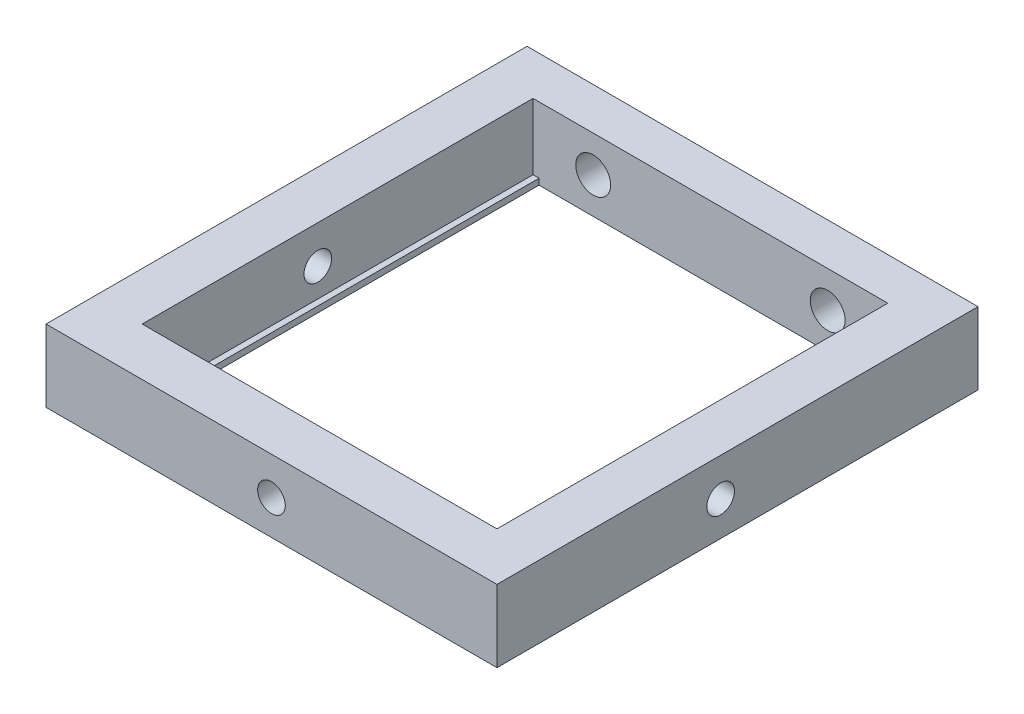
ISO-10303-21;
HEADER;
FILE_DESCRIPTION(('STEP AP214'),'2;1');
FILE_NAME('part.step','',(''),(''),'','','');
FILE_SCHEMA(('AUTOMOTIVE_DESIGN { 1 0 10303 214 1 1 1 1 }'));
ENDSEC;
DATA;
#1=APPLICATION_CONTEXT('core data for automotive mechanical design processes');
#2=APPLICATION_PROTOCOL_DEFINITION('international standard','automotive_design',2000,#1);
#3=PRODUCT_CONTEXT('',#1,'mechanical');
#4=PRODUCT('Part','Part','',(#3));
#5=PRODUCT_RELATED_PRODUCT_CATEGORY('part','',(#4));
#6=PRODUCT_DEFINITION_FORMATION('','',#4);
#7=PRODUCT_DEFINITION_CONTEXT('part definition',#1,'design');
#8=PRODUCT_DEFINITION('design','',#6,#7);
#9=PRODUCT_DEFINITION_SHAPE('','',#8);
#10=(LENGTH_UNIT() NAMED_UNIT(*) SI_UNIT(.MILLI.,.METRE.));
#11=(NAMED_UNIT(*) PLANE_ANGLE_UNIT() SI_UNIT($,.RADIAN.));
#12=(NAMED_UNIT(*) SI_UNIT($,.STERADIAN.) SOLID_ANGLE_UNIT());
#13=UNCERTAINTY_MEASURE_WITH_UNIT(LENGTH_MEASURE(1.E-05),#10,'distance_accuracy_value','');
#14=(GEOMETRIC_REPRESENTATION_CONTEXT(3) GLOBAL_UNCERTAINTY_ASSIGNED_CONTEXT((#13)) GLOBAL_UNIT_ASSIGNED_CONTEXT((#10,
#11,#12)) REPRESENTATION_CONTEXT('',''));
#15=CARTESIAN_POINT('',(0.,0.,0.));
#16=DIRECTION('',(0.,0.,1.));
#17=DIRECTION('',(1.,0.,0.));
#18=AXIS2_PLACEMENT_3D('',#15,#16,#17);
#19=CARTESIAN_POINT('',(0.,1.,0.));
#20=DIRECTION('',(0.,-1.,0.));
#21=DIRECTION('',(0.,0.,-1.));
#22=AXIS2_PLACEMENT_3D('',#19,#20,#21);
#23=PLANE('',#22);
#24=DIRECTION('',(1.,0.,0.));
#25=VECTOR('',#24,1.);
#26=CARTESIAN_POINT('',(-28.5,1.,31.));
#27=LINE('',#26,#25);
#28=CARTESIAN_POINT('',(-28.5,1.,31.));
#29=VERTEX_POINT('',#28);
#30=CARTESIAN_POINT('',(28.5,1.,31.));
#31=VERTEX_POINT('',#30);
#32=EDGE_CURVE('E144',#29,#31,#27,.T.);
#33=ORIENTED_EDGE('',*,*,#32,.F.);
#34=DIRECTION('',(0.,0.,1.));
#35=VECTOR('',#34,1.);
#36=CARTESIAN_POINT('',(-28.5,1.,-33.));
#37=LINE('',#36,#35);
#38=CARTESIAN_POINT('',(-28.5,1.,-33.));
#39=VERTEX_POINT('',#38);
#40=EDGE_CURVE('E155',#39,#29,#37,.T.);
#41=ORIENTED_EDGE('',*,*,#40,.F.);
#42=DIRECTION('',(-1.,0.,0.));
#43=VECTOR('',#42,1.);
#44=CARTESIAN_POINT('',(-29.5,1.,-33.));
#45=LINE('',#44,#43);
#46=CARTESIAN_POINT('',(-29.5,1.,-33.));
#47=VERTEX_POINT('',#46);
#48=EDGE_CURVE('E217',#39,#47,#45,.T.);
#49=ORIENTED_EDGE('',*,*,#48,.T.);
#50=DIRECTION('',(0.,0.,1.));
#51=VECTOR('',#50,1.);
#52=CARTESIAN_POINT('',(-29.5,1.,32.));
#53=LINE('',#52,#51);
#54=CARTESIAN_POINT('',(-29.5,1.,32.));
#55=VERTEX_POINT('',#54);
#56=EDGE_CURVE('E204',#47,#55,#53,.T.);
#57=ORIENTED_EDGE('',*,*,#56,.T.);
#58=DIRECTION('',(1.,0.,0.));
#59=VECTOR('',#58,1.);
#60=CARTESIAN_POINT('',(-29.5,1.,32.));
#61=LINE('',#60,#59);
#62=CARTESIAN_POINT('',(29.5,1.,32.));
#63=VERTEX_POINT('',#62);
#64=EDGE_CURVE('E208',#55,#63,#61,.T.);
#65=ORIENTED_EDGE('',*,*,#64,.T.);
#66=DIRECTION('',(0.,0.,-1.));
#67=VECTOR('',#66,1.);
#68=CARTESIAN_POINT('',(29.5,1.,32.));
#69=LINE('',#68,#67);
#70=CARTESIAN_POINT('',(29.5,1.,-33.));
#71=VERTEX_POINT('',#70);
#72=EDGE_CURVE('E213',#63,#71,#69,.T.);
#73=ORIENTED_EDGE('',*,*,#72,.T.);
#74=CARTESIAN_POINT('',(28.5,1.,-33.));
#75=VERTEX_POINT('',#74);
#76=EDGE_CURVE('E224',#71,#75,#45,.T.);
#77=ORIENTED_EDGE('',*,*,#76,.T.);
#78=DIRECTION('',(0.,0.,-1.));
#79=VECTOR('',#78,1.);
#80=CARTESIAN_POINT('',(28.5,1.,-33.));
#81=LINE('',#80,#79);
#82=EDGE_CURVE('E152',#31,#75,#81,.T.);
#83=ORIENTED_EDGE('',*,*,#82,.F.);
#84=EDGE_LOOP('',(#33,#41,#49,#57,#65,#73,#77,#83));
#85=FACE_BOUND('',#84,.T.);
#86=ADVANCED_FACE('F39',(#85),#23,.F.);
#87=CARTESIAN_POINT('',(37.5,12.,40.));
#88=DIRECTION('',(-1.,0.,0.));
#89=DIRECTION('',(0.,0.,1.));
#90=AXIS2_PLACEMENT_3D('',#87,#88,#89);
#91=PLANE('',#90);
#92=CARTESIAN_POINT('',(37.5,5.71956913759278,2.8));
#93=DIRECTION('',(1.,0.,0.));
#94=DIRECTION('',(0.,0.,-1.));
#95=AXIS2_PLACEMENT_3D('',#92,#93,#94);
#96=CIRCLE('',#95,2.3);
#97=CARTESIAN_POINT('',(37.5,5.71956913759278,0.499999999999997));
#98=VERTEX_POINT('',#97);
#99=EDGE_CURVE('E375',#98,#98,#96,.T.);
#100=ORIENTED_EDGE('',*,*,#99,.F.);
#101=EDGE_LOOP('',(#100));
#102=FACE_BOUND('',#101,.T.);
#103=DIRECTION('',(0.,0.,-1.));
#104=VECTOR('',#103,1.);
#105=CARTESIAN_POINT('',(37.5,0.,40.));
#106=LINE('',#105,#104);
#107=CARTESIAN_POINT('',(37.5,0.,40.));
#108=VERTEX_POINT('',#107);
#109=CARTESIAN_POINT('',(37.5,0.,-40.));
#110=VERTEX_POINT('',#109);
#111=EDGE_CURVE('E249',#108,#110,#106,.T.);
#112=ORIENTED_EDGE('',*,*,#111,.T.);
#113=DIRECTION('',(0.,-1.,0.));
#114=VECTOR('',#113,1.);
#115=CARTESIAN_POINT('',(37.5,12.,-40.));
#116=LINE('',#115,#114);
#117=CARTESIAN_POINT('',(37.5,12.,-40.));
#118=VERTEX_POINT('',#117);
#119=EDGE_CURVE('E49',#118,#110,#116,.T.);
#120=ORIENTED_EDGE('',*,*,#119,.F.);
#121=DIRECTION('',(0.,0.,-1.));
#122=VECTOR('',#121,1.);
#123=CARTESIAN_POINT('',(37.5,12.,40.));
#124=LINE('',#123,#122);
#125=CARTESIAN_POINT('',(37.5,12.,40.));
#126=VERTEX_POINT('',#125);
#127=EDGE_CURVE('E242',#126,#118,#124,.T.);
#128=ORIENTED_EDGE('',*,*,#127,.F.);
#129=DIRECTION('',(0.,-1.,0.));
#130=VECTOR('',#129,1.);
#131=CARTESIAN_POINT('',(37.5,12.,40.));
#132=LINE('',#131,#130);
#133=EDGE_CURVE('E237',#126,#108,#132,.T.);
#134=ORIENTED_EDGE('',*,*,#133,.T.);
#135=EDGE_LOOP('',(#112,#120,#128,#134));
#136=FACE_BOUND('',#135,.T.);
#137=ADVANCED_FACE('F41',(#102,#136),#91,.F.);
#138=CARTESIAN_POINT('',(-37.5,12.,-40.));
#139=DIRECTION('',(0.,0.,1.));
#140=DIRECTION('',(1.,0.,0.));
#141=AXIS2_PLACEMENT_3D('',#138,#139,#140);
#142=PLANE('',#141);
#143=CARTESIAN_POINT('',(-19.5,5.96242979521355,-40.));
#144=DIRECTION('',(0.,0.,-1.));
#145=DIRECTION('',(-1.,0.,0.));
#146=AXIS2_PLACEMENT_3D('',#143,#144,#145);
#147=CIRCLE('',#146,2.9);
#148=CARTESIAN_POINT('',(-22.4,5.96242979521355,-40.));
#149=VERTEX_POINT('',#148);
#150=EDGE_CURVE('E185',#149,#149,#147,.T.);
#151=ORIENTED_EDGE('',*,*,#150,.F.);
#152=EDGE_LOOP('',(#151));
#153=FACE_BOUND('',#152,.T.);
#154=CARTESIAN_POINT('',(19.5,5.96242979521355,-40.));
#155=DIRECTION('',(0.,0.,-1.));
#156=DIRECTION('',(-1.,0.,0.));
#157=AXIS2_PLACEMENT_3D('',#154,#155,#156);
#158=CIRCLE('',#157,2.9);
#159=CARTESIAN_POINT('',(16.6,5.96242979521355,-40.));
#160=VERTEX_POINT('',#159);
#161=EDGE_CURVE('E190',#160,#160,#158,.T.);
#162=ORIENTED_EDGE('',*,*,#161,.F.);
#163=EDGE_LOOP('',(#162));
#164=FACE_BOUND('',#163,.T.);
#165=DIRECTION('',(-1.,0.,0.));
#166=VECTOR('',#165,1.);
#167=CARTESIAN_POINT('',(-37.5,0.,-40.));
#168=LINE('',#167,#166);
#169=CARTESIAN_POINT('',(-37.5,0.,-40.));
#170=VERTEX_POINT('',#169);
#171=EDGE_CURVE('E246',#110,#170,#168,.T.);
#172=ORIENTED_EDGE('',*,*,#171,.T.);
#173=DIRECTION('',(0.,-1.,0.));
#174=VECTOR('',#173,1.);
#175=CARTESIAN_POINT('',(-37.5,12.,-40.));
#176=LINE('',#175,#174);
#177=CARTESIAN_POINT('',(-37.5,12.,-40.));
#178=VERTEX_POINT('',#177);
#179=EDGE_CURVE('E230',#178,#170,#176,.T.);
#180=ORIENTED_EDGE('',*,*,#179,.F.);
#181=DIRECTION('',(-1.,0.,0.));
#182=VECTOR('',#181,1.);
#183=CARTESIAN_POINT('',(-37.5,12.,-40.));
#184=LINE('',#183,#182);
#185=EDGE_CURVE('E94',#118,#178,#184,.T.);
#186=ORIENTED_EDGE('',*,*,#185,.F.);
#187=ORIENTED_EDGE('',*,*,#119,.T.);
#188=EDGE_LOOP('',(#172,#180,#186,#187));
#189=FACE_BOUND('',#188,.T.);
#190=ADVANCED_FACE('F321',(#153,#164,#189),#142,.F.);
#191=CARTESIAN_POINT('',(-37.5,12.,40.));
#192=DIRECTION('',(1.,0.,0.));
#193=DIRECTION('',(0.,0.,-1.));
#194=AXIS2_PLACEMENT_3D('',#191,#192,#193);
#195=PLANE('',#194);
#196=CARTESIAN_POINT('',(-37.5,5.71956913759278,2.8));
#197=DIRECTION('',(1.,0.,0.));
#198=DIRECTION('',(0.,0.,-1.));
#199=AXIS2_PLACEMENT_3D('',#196,#197,#198);
#200=CIRCLE('',#199,2.3);
#201=CARTESIAN_POINT('',(-37.5,5.71956913759278,0.499999999999997));
#202=VERTEX_POINT('',#201);
#203=EDGE_CURVE('E379',#202,#202,#200,.T.);
#204=ORIENTED_EDGE('',*,*,#203,.T.);
#205=EDGE_LOOP('',(#204));
#206=FACE_BOUND('',#205,.T.);
#207=DIRECTION('',(0.,0.,1.));
#208=VECTOR('',#207,1.);
#209=CARTESIAN_POINT('',(-37.5,0.,40.));
#210=LINE('',#209,#208);
#211=CARTESIAN_POINT('',(-37.5,0.,40.));
#212=VERTEX_POINT('',#211);
#213=EDGE_CURVE('E243',#170,#212,#210,.T.);
#214=ORIENTED_EDGE('',*,*,#213,.T.);
#215=DIRECTION('',(0.,-1.,0.));
#216=VECTOR('',#215,1.);
#217=CARTESIAN_POINT('',(-37.5,12.,40.));
#218=LINE('',#217,#216);
#219=CARTESIAN_POINT('',(-37.5,12.,40.));
#220=VERTEX_POINT('',#219);
#221=EDGE_CURVE('E234',#220,#212,#218,.T.);
#222=ORIENTED_EDGE('',*,*,#221,.F.);
#223=DIRECTION('',(0.,0.,1.));
#224=VECTOR('',#223,1.);
#225=CARTESIAN_POINT('',(-37.5,12.,40.));
#226=LINE('',#225,#224);
#227=EDGE_CURVE('E256',#178,#220,#226,.T.);
#228=ORIENTED_EDGE('',*,*,#227,.F.);
#229=ORIENTED_EDGE('',*,*,#179,.T.);
#230=EDGE_LOOP('',(#214,#222,#228,#229));
#231=FACE_BOUND('',#230,.T.);
#232=ADVANCED_FACE('F320',(#206,#231),#195,.F.);
#233=CARTESIAN_POINT('',(-37.5,12.,40.));
#234=DIRECTION('',(0.,0.,-1.));
#235=DIRECTION('',(-1.,0.,0.));
#236=AXIS2_PLACEMENT_3D('',#233,#234,#235);
#237=PLANE('',#236);
#238=CARTESIAN_POINT('',(0.,5.75,40.));
#239=DIRECTION('',(0.,0.,1.));
#240=DIRECTION('',(1.,0.,0.));
#241=AXIS2_PLACEMENT_3D('',#238,#239,#240);
#242=CIRCLE('',#241,2.3);
#243=CARTESIAN_POINT('',(2.3,5.75,40.));
#244=VERTEX_POINT('',#243);
#245=EDGE_CURVE('E364',#244,#244,#242,.T.);
#246=ORIENTED_EDGE('',*,*,#245,.F.);
#247=EDGE_LOOP('',(#246));
#248=FACE_BOUND('',#247,.T.);
#249=DIRECTION('',(1.,0.,0.));
#250=VECTOR('',#249,1.);
#251=CARTESIAN_POINT('',(-37.5,0.,40.));
#252=LINE('',#251,#250);
#253=EDGE_CURVE('E86',#212,#108,#252,.T.);
#254=ORIENTED_EDGE('',*,*,#253,.T.);
#255=ORIENTED_EDGE('',*,*,#133,.F.);
#256=DIRECTION('',(1.,0.,0.));
#257=VECTOR('',#256,1.);
#258=CARTESIAN_POINT('',(-37.5,12.,40.));
#259=LINE('',#258,#257);
#260=EDGE_CURVE('E65',#220,#126,#259,.T.);
#261=ORIENTED_EDGE('',*,*,#260,.F.);
#262=ORIENTED_EDGE('',*,*,#221,.T.);
#263=EDGE_LOOP('',(#254,#255,#261,#262));
#264=FACE_BOUND('',#263,.T.);
#265=ADVANCED_FACE('F316',(#248,#264),#237,.F.);
#266=CARTESIAN_POINT('',(0.,12.,0.));
#267=DIRECTION('',(0.,-1.,0.));
#268=DIRECTION('',(0.,0.,-1.));
#269=AXIS2_PLACEMENT_3D('',#266,#267,#268);
#270=PLANE('',#269);
#271=DIRECTION('',(1.,0.,0.));
#272=VECTOR('',#271,1.);
#273=CARTESIAN_POINT('',(-29.5,12.,32.));
#274=LINE('',#273,#272);
#275=CARTESIAN_POINT('',(-29.5,12.,32.));
#276=VERTEX_POINT('',#275);
#277=CARTESIAN_POINT('',(29.5,12.,32.));
#278=VERTEX_POINT('',#277);
#279=EDGE_CURVE('E279',#276,#278,#274,.T.);
#280=ORIENTED_EDGE('',*,*,#279,.F.);
#281=DIRECTION('',(0.,0.,1.));
#282=VECTOR('',#281,1.);
#283=CARTESIAN_POINT('',(-29.5,12.,32.));
#284=LINE('',#283,#282);
#285=CARTESIAN_POINT('',(-29.5,12.,-33.));
#286=VERTEX_POINT('',#285);
#287=EDGE_CURVE('E56',#286,#276,#284,.T.);
#288=ORIENTED_EDGE('',*,*,#287,.F.);
#289=DIRECTION('',(-1.,0.,0.));
#290=VECTOR('',#289,1.);
#291=CARTESIAN_POINT('',(-29.5,12.,-33.));
#292=LINE('',#291,#290);
#293=CARTESIAN_POINT('',(29.5,12.,-33.));
#294=VERTEX_POINT('',#293);
#295=EDGE_CURVE('E209',#294,#286,#292,.T.);
#296=ORIENTED_EDGE('',*,*,#295,.F.);
#297=DIRECTION('',(0.,0.,-1.));
#298=VECTOR('',#297,1.);
#299=CARTESIAN_POINT('',(29.5,12.,32.));
#300=LINE('',#299,#298);
#301=EDGE_CURVE('E276',#278,#294,#300,.T.);
#302=ORIENTED_EDGE('',*,*,#301,.F.);
#303=EDGE_LOOP('',(#280,#288,#296,#302));
#304=FACE_BOUND('',#303,.T.);
#305=ORIENTED_EDGE('',*,*,#127,.T.);
#306=ORIENTED_EDGE('',*,*,#185,.T.);
#307=ORIENTED_EDGE('',*,*,#227,.T.);
#308=ORIENTED_EDGE('',*,*,#260,.T.);
#309=EDGE_LOOP('',(#305,#306,#307,#308));
#310=FACE_BOUND('',#309,.T.);
#311=ADVANCED_FACE('F291',(#304,#310),#270,.F.);
#312=CARTESIAN_POINT('',(0.,0.,0.));
#313=DIRECTION('',(0.,-1.,0.));
#314=DIRECTION('',(0.,0.,-1.));
#315=AXIS2_PLACEMENT_3D('',#312,#313,#314);
#316=PLANE('',#315);
#317=DIRECTION('',(-1.,0.,0.));
#318=VECTOR('',#317,1.);
#319=CARTESIAN_POINT('',(-27.5,0.,-33.));
#320=LINE('',#319,#318);
#321=CARTESIAN_POINT('',(28.5,0.,-33.));
#322=VERTEX_POINT('',#321);
#323=CARTESIAN_POINT('',(-28.5,0.,-33.));
#324=VERTEX_POINT('',#323);
#325=EDGE_CURVE('E198',#322,#324,#320,.T.);
#326=ORIENTED_EDGE('',*,*,#325,.T.);
#327=DIRECTION('',(0.,0.,-1.));
#328=VECTOR('',#327,1.);
#329=CARTESIAN_POINT('',(-28.5,0.,0.));
#330=LINE('',#329,#328);
#331=CARTESIAN_POINT('',(-28.5,0.,31.));
#332=VERTEX_POINT('',#331);
#333=EDGE_CURVE('E182',#332,#324,#330,.T.);
#334=ORIENTED_EDGE('',*,*,#333,.F.);
#335=DIRECTION('',(-1.,0.,0.));
#336=VECTOR('',#335,1.);
#337=CARTESIAN_POINT('',(0.,0.,31.));
#338=LINE('',#337,#336);
#339=CARTESIAN_POINT('',(28.5,0.,31.));
#340=VERTEX_POINT('',#339);
#341=EDGE_CURVE('E11',#340,#332,#338,.T.);
#342=ORIENTED_EDGE('',*,*,#341,.F.);
#343=DIRECTION('',(0.,0.,1.));
#344=VECTOR('',#343,1.);
#345=CARTESIAN_POINT('',(28.5,0.,0.));
#346=LINE('',#345,#344);
#347=EDGE_CURVE('E174',#322,#340,#346,.T.);
#348=ORIENTED_EDGE('',*,*,#347,.F.);
#349=EDGE_LOOP('',(#326,#334,#342,#348));
#350=FACE_BOUND('',#349,.T.);
#351=ORIENTED_EDGE('',*,*,#111,.F.);
#352=ORIENTED_EDGE('',*,*,#253,.F.);
#353=ORIENTED_EDGE('',*,*,#213,.F.);
#354=ORIENTED_EDGE('',*,*,#171,.F.);
#355=EDGE_LOOP('',(#351,#352,#353,#354));
#356=FACE_BOUND('',#355,.T.);
#357=ADVANCED_FACE('F306',(#350,#356),#316,.T.);
#358=CARTESIAN_POINT('',(-29.5,1.,32.));
#359=DIRECTION('',(-1.,0.,0.));
#360=DIRECTION('',(0.,0.,1.));
#361=AXIS2_PLACEMENT_3D('',#358,#359,#360);
#362=PLANE('',#361);
#363=CARTESIAN_POINT('',(-29.5,5.71956913759278,2.8));
#364=DIRECTION('',(-1.,0.,0.));
#365=DIRECTION('',(0.,0.,1.));
#366=AXIS2_PLACEMENT_3D('',#363,#364,#365);
#367=CIRCLE('',#366,2.3);
#368=CARTESIAN_POINT('',(-29.5,5.71956913759278,5.1));
#369=VERTEX_POINT('',#368);
#370=EDGE_CURVE('E367',#369,#369,#367,.T.);
#371=ORIENTED_EDGE('',*,*,#370,.T.);
#372=EDGE_LOOP('',(#371));
#373=FACE_BOUND('',#372,.T.);
#374=ORIENTED_EDGE('',*,*,#287,.T.);
#375=DIRECTION('',(0.,1.,0.));
#376=VECTOR('',#375,1.);
#377=CARTESIAN_POINT('',(-29.5,1.,32.));
#378=LINE('',#377,#376);
#379=EDGE_CURVE('E227',#55,#276,#378,.T.);
#380=ORIENTED_EDGE('',*,*,#379,.F.);
#381=ORIENTED_EDGE('',*,*,#56,.F.);
#382=DIRECTION('',(0.,1.,0.));
#383=VECTOR('',#382,1.);
#384=CARTESIAN_POINT('',(-29.5,1.,-33.));
#385=LINE('',#384,#383);
#386=EDGE_CURVE('E253',#47,#286,#385,.T.);
#387=ORIENTED_EDGE('',*,*,#386,.T.);
#388=EDGE_LOOP('',(#374,#380,#381,#387));
#389=FACE_BOUND('',#388,.T.);
#390=ADVANCED_FACE('F297',(#373,#389),#362,.F.);
#391=CARTESIAN_POINT('',(-29.5,1.,-33.));
#392=DIRECTION('',(0.,0.,-1.));
#393=DIRECTION('',(-1.,0.,0.));
#394=AXIS2_PLACEMENT_3D('',#391,#392,#393);
#395=PLANE('',#394);
#396=ORIENTED_EDGE('',*,*,#48,.F.);
#397=DIRECTION('',(0.,1.,0.));
#398=VECTOR('',#397,1.);
#399=CARTESIAN_POINT('',(-28.5,-2.50000000000684E-05,-33.));
#400=LINE('',#399,#398);
#401=EDGE_CURVE('E158',#324,#39,#400,.T.);
#402=ORIENTED_EDGE('',*,*,#401,.F.);
#403=ORIENTED_EDGE('',*,*,#325,.F.);
#404=DIRECTION('',(0.,1.,0.));
#405=VECTOR('',#404,1.);
#406=CARTESIAN_POINT('',(28.5,-2.50000000000684E-05,-33.));
#407=LINE('',#406,#405);
#408=EDGE_CURVE('E175',#322,#75,#407,.T.);
#409=ORIENTED_EDGE('',*,*,#408,.T.);
#410=ORIENTED_EDGE('',*,*,#76,.F.);
#411=DIRECTION('',(0.,1.,0.));
#412=VECTOR('',#411,1.);
#413=CARTESIAN_POINT('',(29.5,1.,-33.));
#414=LINE('',#413,#412);
#415=EDGE_CURVE('E268',#71,#294,#414,.T.);
#416=ORIENTED_EDGE('',*,*,#415,.T.);
#417=ORIENTED_EDGE('',*,*,#295,.T.);
#418=ORIENTED_EDGE('',*,*,#386,.F.);
#419=EDGE_LOOP('',(#396,#402,#403,#409,#410,#416,#417,#418));
#420=FACE_BOUND('',#419,.T.);
#421=CARTESIAN_POINT('',(-19.5,5.96242979521355,-33.));
#422=DIRECTION('',(0.,0.,-1.));
#423=DIRECTION('',(-1.,0.,0.));
#424=AXIS2_PLACEMENT_3D('',#421,#422,#423);
#425=CIRCLE('',#424,2.9);
#426=CARTESIAN_POINT('',(-22.4,5.96242979521355,-33.));
#427=VERTEX_POINT('',#426);
#428=EDGE_CURVE('E186',#427,#427,#425,.T.);
#429=ORIENTED_EDGE('',*,*,#428,.T.);
#430=EDGE_LOOP('',(#429));
#431=FACE_BOUND('',#430,.T.);
#432=CARTESIAN_POINT('',(19.5,5.96242979521355,-33.));
#433=DIRECTION('',(0.,0.,-1.));
#434=DIRECTION('',(-1.,0.,0.));
#435=AXIS2_PLACEMENT_3D('',#432,#433,#434);
#436=CIRCLE('',#435,2.9);
#437=CARTESIAN_POINT('',(16.6,5.96242979521355,-33.));
#438=VERTEX_POINT('',#437);
#439=EDGE_CURVE('E194',#438,#438,#436,.T.);
#440=ORIENTED_EDGE('',*,*,#439,.T.);
#441=EDGE_LOOP('',(#440));
#442=FACE_BOUND('',#441,.T.);
#443=ADVANCED_FACE('F299',(#420,#431,#442),#395,.F.);
#444=CARTESIAN_POINT('',(29.5,1.,32.));
#445=DIRECTION('',(1.,0.,0.));
#446=DIRECTION('',(0.,0.,-1.));
#447=AXIS2_PLACEMENT_3D('',#444,#445,#446);
#448=PLANE('',#447);
#449=CARTESIAN_POINT('',(29.5,5.71956913759278,2.8));
#450=DIRECTION('',(1.,0.,0.));
#451=DIRECTION('',(0.,0.,-1.));
#452=AXIS2_PLACEMENT_3D('',#449,#450,#451);
#453=CIRCLE('',#452,2.3);
#454=CARTESIAN_POINT('',(29.5,5.71956913759278,0.499999999999997));
#455=VERTEX_POINT('',#454);
#456=EDGE_CURVE('E43',#455,#455,#453,.T.);
#457=ORIENTED_EDGE('',*,*,#456,.T.);
#458=EDGE_LOOP('',(#457));
#459=FACE_BOUND('',#458,.T.);
#460=ORIENTED_EDGE('',*,*,#301,.T.);
#461=ORIENTED_EDGE('',*,*,#415,.F.);
#462=ORIENTED_EDGE('',*,*,#72,.F.);
#463=DIRECTION('',(0.,1.,0.));
#464=VECTOR('',#463,1.);
#465=CARTESIAN_POINT('',(29.5,1.,32.));
#466=LINE('',#465,#464);
#467=EDGE_CURVE('E265',#63,#278,#466,.T.);
#468=ORIENTED_EDGE('',*,*,#467,.T.);
#469=EDGE_LOOP('',(#460,#461,#462,#468));
#470=FACE_BOUND('',#469,.T.);
#471=ADVANCED_FACE('F293',(#459,#470),#448,.F.);
#472=CARTESIAN_POINT('',(-29.5,1.,32.));
#473=DIRECTION('',(0.,0.,1.));
#474=DIRECTION('',(1.,0.,0.));
#475=AXIS2_PLACEMENT_3D('',#472,#473,#474);
#476=PLANE('',#475);
#477=CARTESIAN_POINT('',(0.,5.75,32.));
#478=DIRECTION('',(0.,0.,1.));
#479=DIRECTION('',(1.,0.,0.));
#480=AXIS2_PLACEMENT_3D('',#477,#478,#479);
#481=CIRCLE('',#480,2.3);
#482=CARTESIAN_POINT('',(2.3,5.75,32.));
#483=VERTEX_POINT('',#482);
#484=EDGE_CURVE('E162',#483,#483,#481,.T.);
#485=ORIENTED_EDGE('',*,*,#484,.T.);
#486=EDGE_LOOP('',(#485));
#487=FACE_BOUND('',#486,.T.);
#488=ORIENTED_EDGE('',*,*,#279,.T.);
#489=ORIENTED_EDGE('',*,*,#467,.F.);
#490=ORIENTED_EDGE('',*,*,#64,.F.);
#491=ORIENTED_EDGE('',*,*,#379,.T.);
#492=EDGE_LOOP('',(#488,#489,#490,#491));
#493=FACE_BOUND('',#492,.T.);
#494=ADVANCED_FACE('F286',(#487,#493),#476,.F.);
#495=CARTESIAN_POINT('',(19.5,5.96242979521355,-33.));
#496=DIRECTION('',(0.,0.,-1.));
#497=DIRECTION('',(-1.,0.,0.));
#498=AXIS2_PLACEMENT_3D('',#495,#496,#497);
#499=CYLINDRICAL_SURFACE('',#498,2.9);
#500=ORIENTED_EDGE('',*,*,#439,.F.);
#501=EDGE_LOOP('',(#500));
#502=FACE_BOUND('',#501,.T.);
#503=ORIENTED_EDGE('',*,*,#161,.T.);
#504=EDGE_LOOP('',(#503));
#505=FACE_BOUND('',#504,.T.);
#506=ADVANCED_FACE('F342',(#502,#505),#499,.F.);
#507=CARTESIAN_POINT('',(-19.5,5.96242979521355,-33.));
#508=DIRECTION('',(0.,0.,-1.));
#509=DIRECTION('',(-1.,0.,0.));
#510=AXIS2_PLACEMENT_3D('',#507,#508,#509);
#511=CYLINDRICAL_SURFACE('',#510,2.9);
#512=ORIENTED_EDGE('',*,*,#428,.F.);
#513=EDGE_LOOP('',(#512));
#514=FACE_BOUND('',#513,.T.);
#515=ORIENTED_EDGE('',*,*,#150,.T.);
#516=EDGE_LOOP('',(#515));
#517=FACE_BOUND('',#516,.T.);
#518=ADVANCED_FACE('F406',(#514,#517),#511,.F.);
#519=CARTESIAN_POINT('',(-28.5,-2.50000000000684E-05,-33.));
#520=DIRECTION('',(-1.,0.,0.));
#521=DIRECTION('',(0.,0.,1.));
#522=AXIS2_PLACEMENT_3D('',#519,#520,#521);
#523=PLANE('',#522);
#524=ORIENTED_EDGE('',*,*,#333,.T.);
#525=ORIENTED_EDGE('',*,*,#401,.T.);
#526=ORIENTED_EDGE('',*,*,#40,.T.);
#527=DIRECTION('',(0.,1.,0.));
#528=VECTOR('',#527,1.);
#529=CARTESIAN_POINT('',(-28.5,-2.50000000000684E-05,31.));
#530=LINE('',#529,#528);
#531=EDGE_CURVE('E139',#332,#29,#530,.T.);
#532=ORIENTED_EDGE('',*,*,#531,.F.);
#533=EDGE_LOOP('',(#524,#525,#526,#532));
#534=FACE_BOUND('',#533,.T.);
#535=ADVANCED_FACE('F156',(#534),#523,.F.);
#536=CARTESIAN_POINT('',(28.5,-2.50000000000684E-05,-33.));
#537=DIRECTION('',(1.,0.,0.));
#538=DIRECTION('',(0.,0.,-1.));
#539=AXIS2_PLACEMENT_3D('',#536,#537,#538);
#540=PLANE('',#539);
#541=ORIENTED_EDGE('',*,*,#347,.T.);
#542=DIRECTION('',(0.,1.,0.));
#543=VECTOR('',#542,1.);
#544=CARTESIAN_POINT('',(28.5,-2.50000000000684E-05,31.));
#545=LINE('',#544,#543);
#546=EDGE_CURVE('E151',#340,#31,#545,.T.);
#547=ORIENTED_EDGE('',*,*,#546,.T.);
#548=ORIENTED_EDGE('',*,*,#82,.T.);
#549=ORIENTED_EDGE('',*,*,#408,.F.);
#550=EDGE_LOOP('',(#541,#547,#548,#549));
#551=FACE_BOUND('',#550,.T.);
#552=ADVANCED_FACE('F304',(#551),#540,.F.);
#553=CARTESIAN_POINT('',(-28.5,-2.50000000000684E-05,31.));
#554=DIRECTION('',(0.,0.,1.));
#555=DIRECTION('',(1.,0.,0.));
#556=AXIS2_PLACEMENT_3D('',#553,#554,#555);
#557=PLANE('',#556);
#558=ORIENTED_EDGE('',*,*,#341,.T.);
#559=ORIENTED_EDGE('',*,*,#531,.T.);
#560=ORIENTED_EDGE('',*,*,#32,.T.);
#561=ORIENTED_EDGE('',*,*,#546,.F.);
#562=EDGE_LOOP('',(#558,#559,#560,#561));
#563=FACE_BOUND('',#562,.T.);
#564=ADVANCED_FACE('F141',(#563),#557,.F.);
#565=CARTESIAN_POINT('',(0.,5.75,32.));
#566=DIRECTION('',(0.,0.,1.));
#567=DIRECTION('',(1.,0.,0.));
#568=AXIS2_PLACEMENT_3D('',#565,#566,#567);
#569=CYLINDRICAL_SURFACE('',#568,2.3);
#570=ORIENTED_EDGE('',*,*,#484,.F.);
#571=EDGE_LOOP('',(#570));
#572=FACE_BOUND('',#571,.T.);
#573=ORIENTED_EDGE('',*,*,#245,.T.);
#574=EDGE_LOOP('',(#573));
#575=FACE_BOUND('',#574,.T.);
#576=ADVANCED_FACE('F390',(#572,#575),#569,.F.);
#577=CARTESIAN_POINT('',(-37.5,5.71956913759278,2.8));
#578=DIRECTION('',(1.,0.,0.));
#579=DIRECTION('',(0.,0.,-1.));
#580=AXIS2_PLACEMENT_3D('',#577,#578,#579);
#581=CYLINDRICAL_SURFACE('',#580,2.3);
#582=ORIENTED_EDGE('',*,*,#99,.T.);
#583=EDGE_LOOP('',(#582));
#584=FACE_BOUND('',#583,.T.);
#585=ORIENTED_EDGE('',*,*,#456,.F.);
#586=EDGE_LOOP('',(#585));
#587=FACE_BOUND('',#586,.T.);
#588=ADVANCED_FACE('F387',(#584,#587),#581,.F.);
#589=ORIENTED_EDGE('',*,*,#203,.F.);
#590=EDGE_LOOP('',(#589));
#591=FACE_BOUND('',#590,.T.);
#592=ORIENTED_EDGE('',*,*,#370,.F.);
#593=EDGE_LOOP('',(#592));
#594=FACE_BOUND('',#593,.T.);
#595=ADVANCED_FACE('F389',(#591,#594),#581,.F.);
#596=CLOSED_SHELL('',(#86,#137,#190,#232,#265,#311,#357,#390,#443,#471,#494,#506,#518,#535,#552,
#564,#576,#588,#595));
#597=MANIFOLD_SOLID_BREP('B2',#596);
#598=ADVANCED_BREP_SHAPE_REPRESENTATION('',(#18,#597),#14);
#599=SHAPE_DEFINITION_REPRESENTATION(#9,#598);
ENDSEC;
END-ISO-10303-21;
